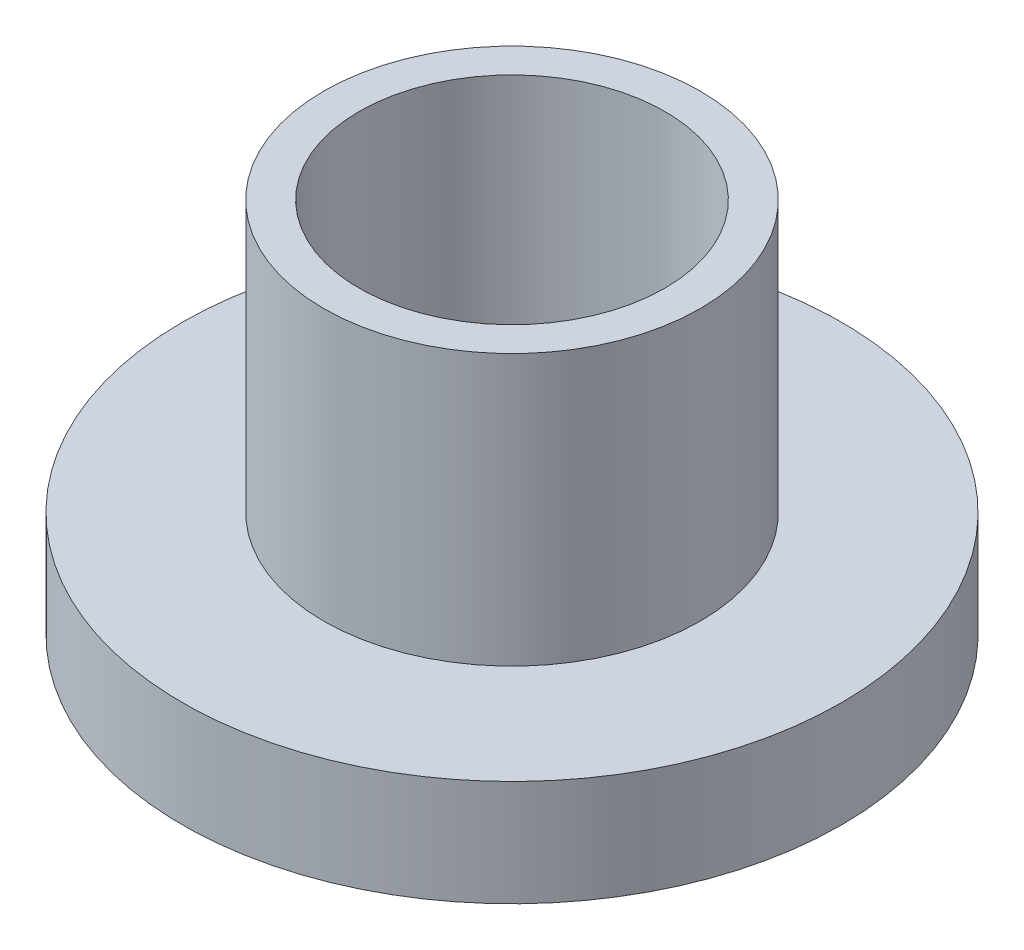
ISO-10303-21;
HEADER;
FILE_DESCRIPTION(('STEP AP214'),'2;1');
FILE_NAME('part.step','',(''),(''),'','','');
FILE_SCHEMA(('AUTOMOTIVE_DESIGN { 1 0 10303 214 1 1 1 1 }'));
ENDSEC;
DATA;
#1=APPLICATION_CONTEXT('core data for automotive mechanical design processes');
#2=APPLICATION_PROTOCOL_DEFINITION('international standard','automotive_design',2000,#1);
#3=PRODUCT_CONTEXT('',#1,'mechanical');
#4=PRODUCT('Part','Part','',(#3));
#5=PRODUCT_RELATED_PRODUCT_CATEGORY('part','',(#4));
#6=PRODUCT_DEFINITION_FORMATION('','',#4);
#7=PRODUCT_DEFINITION_CONTEXT('part definition',#1,'design');
#8=PRODUCT_DEFINITION('design','',#6,#7);
#9=PRODUCT_DEFINITION_SHAPE('','',#8);
#10=(LENGTH_UNIT() NAMED_UNIT(*) SI_UNIT(.MILLI.,.METRE.));
#11=(NAMED_UNIT(*) PLANE_ANGLE_UNIT() SI_UNIT($,.RADIAN.));
#12=(NAMED_UNIT(*) SI_UNIT($,.STERADIAN.) SOLID_ANGLE_UNIT());
#13=UNCERTAINTY_MEASURE_WITH_UNIT(LENGTH_MEASURE(1.E-05),#10,'distance_accuracy_value','');
#14=(GEOMETRIC_REPRESENTATION_CONTEXT(3) GLOBAL_UNCERTAINTY_ASSIGNED_CONTEXT((#13)) GLOBAL_UNIT_ASSIGNED_CONTEXT((#10,
#11,#12)) REPRESENTATION_CONTEXT('',''));
#15=CARTESIAN_POINT('',(0.,0.,0.));
#16=DIRECTION('',(0.,0.,1.));
#17=DIRECTION('',(1.,0.,0.));
#18=AXIS2_PLACEMENT_3D('',#15,#16,#17);
#19=CARTESIAN_POINT('',(-0.207925581395346,-2.79754418604651,0.));
#20=DIRECTION('',(0.,-1.,0.));
#21=DIRECTION('',(1.,0.,0.));
#22=AXIS2_PLACEMENT_3D('',#19,#20,#21);
#23=CYLINDRICAL_SURFACE('',#22,7.112);
#24=CARTESIAN_POINT('',(-0.207925581395346,-2.79754418604651,0.));
#25=DIRECTION('',(0.,-1.,0.));
#26=DIRECTION('',(1.,0.,0.));
#27=AXIS2_PLACEMENT_3D('',#24,#25,#26);
#28=CIRCLE('',#27,7.112);
#29=CARTESIAN_POINT('',(6.90407441860465,-2.7975441860465,0.));
#30=VERTEX_POINT('',#29);
#31=EDGE_CURVE('E10',#30,#30,#28,.T.);
#32=ORIENTED_EDGE('',*,*,#31,.F.);
#33=EDGE_LOOP('',(#32));
#34=FACE_BOUND('',#33,.T.);
#35=CARTESIAN_POINT('',(-0.207925581395347,-0.511544186046507,0.));
#36=DIRECTION('',(0.,-1.,0.));
#37=DIRECTION('',(1.,0.,0.));
#38=AXIS2_PLACEMENT_3D('',#35,#36,#37);
#39=CIRCLE('',#38,7.112);
#40=CARTESIAN_POINT('',(6.90407441860465,-0.511544186046505,0.));
#41=VERTEX_POINT('',#40);
#42=EDGE_CURVE('E55',#41,#41,#39,.T.);
#43=ORIENTED_EDGE('',*,*,#42,.T.);
#44=EDGE_LOOP('',(#43));
#45=FACE_BOUND('',#44,.T.);
#46=ADVANCED_FACE('F33',(#34,#45),#23,.T.);
#47=CARTESIAN_POINT('',(0.,-2.79754418604651,0.));
#48=DIRECTION('',(0.,1.,0.));
#49=DIRECTION('',(-1.,0.,0.));
#50=AXIS2_PLACEMENT_3D('',#47,#48,#49);
#51=PLANE('',#50);
#52=CARTESIAN_POINT('',(-0.207925581395346,-2.79754418604651,0.));
#53=DIRECTION('',(0.,-1.,0.));
#54=DIRECTION('',(1.,0.,0.));
#55=AXIS2_PLACEMENT_3D('',#52,#53,#54);
#56=CIRCLE('',#55,3.302);
#57=CARTESIAN_POINT('',(3.09407441860465,-2.79754418604651,0.));
#58=VERTEX_POINT('',#57);
#59=EDGE_CURVE('E39',#58,#58,#56,.T.);
#60=ORIENTED_EDGE('',*,*,#59,.F.);
#61=EDGE_LOOP('',(#60));
#62=FACE_BOUND('',#61,.T.);
#63=ORIENTED_EDGE('',*,*,#31,.T.);
#64=EDGE_LOOP('',(#63));
#65=FACE_BOUND('',#64,.T.);
#66=ADVANCED_FACE('F72',(#62,#65),#51,.F.);
#67=CARTESIAN_POINT('',(-0.207925581395346,-2.79754418604651,0.));
#68=DIRECTION('',(0.,-1.,0.));
#69=DIRECTION('',(1.,0.,0.));
#70=AXIS2_PLACEMENT_3D('',#67,#68,#69);
#71=CYLINDRICAL_SURFACE('',#70,3.302);
#72=ORIENTED_EDGE('',*,*,#59,.T.);
#73=EDGE_LOOP('',(#72));
#74=FACE_BOUND('',#73,.T.);
#75=CARTESIAN_POINT('',(-0.207925581395349,5.33045581395349,0.));
#76=DIRECTION('',(0.,-1.,0.));
#77=DIRECTION('',(1.,0.,0.));
#78=AXIS2_PLACEMENT_3D('',#75,#76,#77);
#79=CIRCLE('',#78,3.302);
#80=CARTESIAN_POINT('',(3.09407441860465,5.33045581395349,0.));
#81=VERTEX_POINT('',#80);
#82=EDGE_CURVE('E43',#81,#81,#79,.T.);
#83=ORIENTED_EDGE('',*,*,#82,.F.);
#84=EDGE_LOOP('',(#83));
#85=FACE_BOUND('',#84,.T.);
#86=ADVANCED_FACE('F77',(#74,#85),#71,.F.);
#87=CARTESIAN_POINT('',(0.,5.33045581395349,0.));
#88=DIRECTION('',(0.,1.,0.));
#89=DIRECTION('',(-1.,0.,0.));
#90=AXIS2_PLACEMENT_3D('',#87,#88,#89);
#91=PLANE('',#90);
#92=ORIENTED_EDGE('',*,*,#82,.T.);
#93=EDGE_LOOP('',(#92));
#94=FACE_BOUND('',#93,.T.);
#95=CARTESIAN_POINT('',(-0.207925581395349,5.33045581395349,0.));
#96=DIRECTION('',(0.,-1.,0.));
#97=DIRECTION('',(1.,0.,0.));
#98=AXIS2_PLACEMENT_3D('',#95,#96,#97);
#99=CIRCLE('',#98,4.064);
#100=CARTESIAN_POINT('',(3.85607441860465,5.33045581395349,0.));
#101=VERTEX_POINT('',#100);
#102=EDGE_CURVE('E47',#101,#101,#99,.T.);
#103=ORIENTED_EDGE('',*,*,#102,.F.);
#104=EDGE_LOOP('',(#103));
#105=FACE_BOUND('',#104,.T.);
#106=ADVANCED_FACE('F68',(#94,#105),#91,.T.);
#107=CARTESIAN_POINT('',(-0.207925581395346,-2.79754418604651,0.));
#108=DIRECTION('',(0.,-1.,0.));
#109=DIRECTION('',(1.,0.,0.));
#110=AXIS2_PLACEMENT_3D('',#107,#108,#109);
#111=CYLINDRICAL_SURFACE('',#110,4.064);
#112=CARTESIAN_POINT('',(-0.207925581395347,-0.511544186046508,0.));
#113=DIRECTION('',(0.,-1.,0.));
#114=DIRECTION('',(1.,0.,0.));
#115=AXIS2_PLACEMENT_3D('',#112,#113,#114);
#116=CIRCLE('',#115,4.064);
#117=CARTESIAN_POINT('',(3.85607441860465,-0.511544186046507,0.));
#118=VERTEX_POINT('',#117);
#119=EDGE_CURVE('E52',#118,#118,#116,.T.);
#120=ORIENTED_EDGE('',*,*,#119,.F.);
#121=EDGE_LOOP('',(#120));
#122=FACE_BOUND('',#121,.T.);
#123=ORIENTED_EDGE('',*,*,#102,.T.);
#124=EDGE_LOOP('',(#123));
#125=FACE_BOUND('',#124,.T.);
#126=ADVANCED_FACE('F62',(#122,#125),#111,.T.);
#127=CARTESIAN_POINT('',(0.,-0.511544186046508,0.));
#128=DIRECTION('',(0.,1.,0.));
#129=DIRECTION('',(-1.,0.,0.));
#130=AXIS2_PLACEMENT_3D('',#127,#128,#129);
#131=PLANE('',#130);
#132=ORIENTED_EDGE('',*,*,#119,.T.);
#133=EDGE_LOOP('',(#132));
#134=FACE_BOUND('',#133,.T.);
#135=ORIENTED_EDGE('',*,*,#42,.F.);
#136=EDGE_LOOP('',(#135));
#137=FACE_BOUND('',#136,.T.);
#138=ADVANCED_FACE('F60',(#134,#137),#131,.T.);
#139=CLOSED_SHELL('',(#46,#66,#86,#106,#126,#138));
#140=MANIFOLD_SOLID_BREP('B2',#139);
#141=ADVANCED_BREP_SHAPE_REPRESENTATION('',(#18,#140),#14);
#142=SHAPE_DEFINITION_REPRESENTATION(#9,#141);
ENDSEC;
END-ISO-10303-21;
